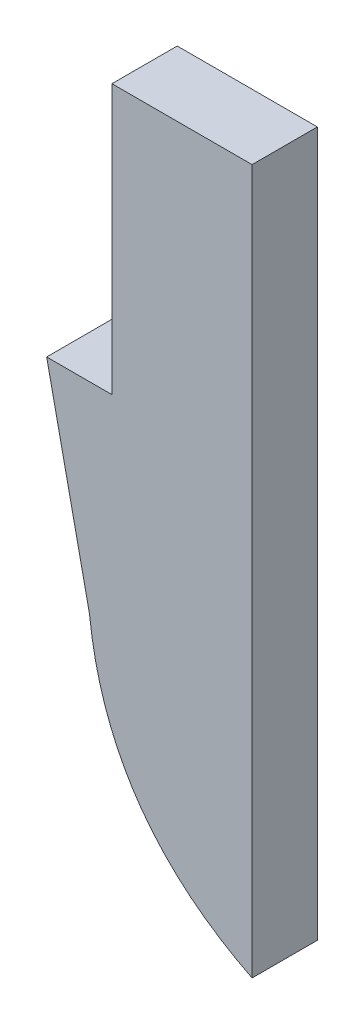
ISO-10303-21;
HEADER;
FILE_DESCRIPTION(('STEP AP214'),'2;1');
FILE_NAME('part.step','',(''),(''),'','','');
FILE_SCHEMA(('AUTOMOTIVE_DESIGN { 1 0 10303 214 1 1 1 1 }'));
ENDSEC;
DATA;
#1=APPLICATION_CONTEXT('core data for automotive mechanical design processes');
#2=APPLICATION_PROTOCOL_DEFINITION('international standard','automotive_design',2000,#1);
#3=PRODUCT_CONTEXT('',#1,'mechanical');
#4=PRODUCT('Part','Part','',(#3));
#5=PRODUCT_RELATED_PRODUCT_CATEGORY('part','',(#4));
#6=PRODUCT_DEFINITION_FORMATION('','',#4);
#7=PRODUCT_DEFINITION_CONTEXT('part definition',#1,'design');
#8=PRODUCT_DEFINITION('design','',#6,#7);
#9=PRODUCT_DEFINITION_SHAPE('','',#8);
#10=(LENGTH_UNIT() NAMED_UNIT(*) SI_UNIT(.MILLI.,.METRE.));
#11=(NAMED_UNIT(*) PLANE_ANGLE_UNIT() SI_UNIT($,.RADIAN.));
#12=(NAMED_UNIT(*) SI_UNIT($,.STERADIAN.) SOLID_ANGLE_UNIT());
#13=UNCERTAINTY_MEASURE_WITH_UNIT(LENGTH_MEASURE(1.E-05),#10,'distance_accuracy_value','');
#14=(GEOMETRIC_REPRESENTATION_CONTEXT(3) GLOBAL_UNCERTAINTY_ASSIGNED_CONTEXT((#13)) GLOBAL_UNIT_ASSIGNED_CONTEXT((#10,
#11,#12)) REPRESENTATION_CONTEXT('',''));
#15=CARTESIAN_POINT('',(0.,0.,0.));
#16=DIRECTION('',(0.,0.,1.));
#17=DIRECTION('',(1.,0.,0.));
#18=AXIS2_PLACEMENT_3D('',#15,#16,#17);
#19=CARTESIAN_POINT('',(-82.4247783156563,-3.69786068719636,4.));
#20=DIRECTION('',(1.,0.,0.));
#21=DIRECTION('',(0.,0.,-1.));
#22=AXIS2_PLACEMENT_3D('',#19,#20,#21);
#23=PLANE('',#22);
#24=DIRECTION('',(0.,-1.,0.));
#25=VECTOR('',#24,1.);
#26=CARTESIAN_POINT('',(-82.4247783156563,-3.69786068719636,0.));
#27=LINE('',#26,#25);
#28=CARTESIAN_POINT('',(-82.4247783156563,-3.69786068719636,0.));
#29=VERTEX_POINT('',#28);
#30=CARTESIAN_POINT('',(-82.4247783156563,-20.1978606871964,0.));
#31=VERTEX_POINT('',#30);
#32=EDGE_CURVE('E119',#29,#31,#27,.T.);
#33=ORIENTED_EDGE('',*,*,#32,.T.);
#34=DIRECTION('',(0.,0.,-1.));
#35=VECTOR('',#34,1.);
#36=CARTESIAN_POINT('',(-82.4247783156563,-20.1978606871964,4.));
#37=LINE('',#36,#35);
#38=CARTESIAN_POINT('',(-82.4247783156563,-20.1978606871964,4.));
#39=VERTEX_POINT('',#38);
#40=EDGE_CURVE('E11',#39,#31,#37,.T.);
#41=ORIENTED_EDGE('',*,*,#40,.F.);
#42=DIRECTION('',(0.,-1.,0.));
#43=VECTOR('',#42,1.);
#44=CARTESIAN_POINT('',(-82.4247783156563,-3.69786068719636,4.));
#45=LINE('',#44,#43);
#46=CARTESIAN_POINT('',(-82.4247783156563,-3.69786068719636,4.));
#47=VERTEX_POINT('',#46);
#48=EDGE_CURVE('E134',#47,#39,#45,.T.);
#49=ORIENTED_EDGE('',*,*,#48,.F.);
#50=DIRECTION('',(0.,0.,-1.));
#51=VECTOR('',#50,1.);
#52=CARTESIAN_POINT('',(-82.4247783156563,-3.69786068719636,4.));
#53=LINE('',#52,#51);
#54=EDGE_CURVE('E112',#47,#29,#53,.T.);
#55=ORIENTED_EDGE('',*,*,#54,.T.);
#56=EDGE_LOOP('',(#33,#41,#49,#55));
#57=FACE_BOUND('',#56,.T.);
#58=ADVANCED_FACE('F32',(#57),#23,.F.);
#59=CARTESIAN_POINT('',(-82.4247783156563,-20.1978606871964,4.));
#60=DIRECTION('',(0.,-1.,0.));
#61=DIRECTION('',(0.,0.,-1.));
#62=AXIS2_PLACEMENT_3D('',#59,#60,#61);
#63=PLANE('',#62);
#64=DIRECTION('',(-1.,0.,0.));
#65=VECTOR('',#64,1.);
#66=CARTESIAN_POINT('',(-82.4247783156563,-20.1978606871964,0.));
#67=LINE('',#66,#65);
#68=CARTESIAN_POINT('',(-86.4247783156563,-20.1978606871964,0.));
#69=VERTEX_POINT('',#68);
#70=EDGE_CURVE('E122',#31,#69,#67,.T.);
#71=ORIENTED_EDGE('',*,*,#70,.T.);
#72=DIRECTION('',(0.,0.,-1.));
#73=VECTOR('',#72,1.);
#74=CARTESIAN_POINT('',(-86.4247783156563,-20.1978606871964,4.));
#75=LINE('',#74,#73);
#76=CARTESIAN_POINT('',(-86.4247783156563,-20.1978606871964,4.));
#77=VERTEX_POINT('',#76);
#78=EDGE_CURVE('E40',#77,#69,#75,.T.);
#79=ORIENTED_EDGE('',*,*,#78,.F.);
#80=DIRECTION('',(-1.,0.,0.));
#81=VECTOR('',#80,1.);
#82=CARTESIAN_POINT('',(-82.4247783156563,-20.1978606871964,4.));
#83=LINE('',#82,#81);
#84=EDGE_CURVE('E85',#39,#77,#83,.T.);
#85=ORIENTED_EDGE('',*,*,#84,.F.);
#86=ORIENTED_EDGE('',*,*,#40,.T.);
#87=EDGE_LOOP('',(#71,#79,#85,#86));
#88=FACE_BOUND('',#87,.T.);
#89=ADVANCED_FACE('F158',(#88),#63,.F.);
#90=CARTESIAN_POINT('',(-86.4247783156563,-20.1978606871964,4.));
#91=DIRECTION('',(0.978101682440699,0.208127602221989,0.));
#92=DIRECTION('',(-0.208127602221989,0.978101682440699,0.));
#93=AXIS2_PLACEMENT_3D('',#90,#91,#92);
#94=PLANE('',#93);
#95=DIRECTION('',(0.208127602221989,-0.978101682440699,0.));
#96=VECTOR('',#95,1.);
#97=CARTESIAN_POINT('',(-86.4247783156563,-20.1978606871964,0.));
#98=LINE('',#97,#96);
#99=CARTESIAN_POINT('',(-83.7953788544437,-32.5547994563157,0.));
#100=VERTEX_POINT('',#99);
#101=EDGE_CURVE('E124',#69,#100,#98,.T.);
#102=ORIENTED_EDGE('',*,*,#101,.T.);
#103=DIRECTION('',(0.,0.,-1.));
#104=VECTOR('',#103,1.);
#105=CARTESIAN_POINT('',(-83.7953788544437,-32.5547994563157,4.));
#106=LINE('',#105,#104);
#107=CARTESIAN_POINT('',(-83.7953788544437,-32.5547994563157,4.));
#108=VERTEX_POINT('',#107);
#109=EDGE_CURVE('E107',#108,#100,#106,.T.);
#110=ORIENTED_EDGE('',*,*,#109,.F.);
#111=DIRECTION('',(0.208127602221989,-0.978101682440699,0.));
#112=VECTOR('',#111,1.);
#113=CARTESIAN_POINT('',(-86.4247783156563,-20.1978606871964,4.));
#114=LINE('',#113,#112);
#115=EDGE_CURVE('E98',#77,#108,#114,.T.);
#116=ORIENTED_EDGE('',*,*,#115,.F.);
#117=ORIENTED_EDGE('',*,*,#78,.T.);
#118=EDGE_LOOP('',(#102,#110,#116,#117));
#119=FACE_BOUND('',#118,.T.);
#120=ADVANCED_FACE('F140',(#119),#94,.F.);
#121=CARTESIAN_POINT('',(-83.7953788544437,-32.5547994563157,4.));
#122=CARTESIAN_POINT('',(-82.7209743375632,-42.4101987800497,4.));
#123=CARTESIAN_POINT('',(-73.8381444014448,-46.8596869037754,4.));
#124=B_SPLINE_CURVE_WITH_KNOTS('',2,(#121,#122,#123),.UNSPECIFIED.,.F.,.F.,(3,3),(0.,1.),.UNSPECIFIED.);
#125=DIRECTION('',(0.,0.,-1.));
#126=VECTOR('',#125,1.);
#127=SURFACE_OF_LINEAR_EXTRUSION('',#124,#126);
#128=CARTESIAN_POINT('',(-83.7953788544437,-32.5547994563157,0.));
#129=CARTESIAN_POINT('',(-82.7209743375632,-42.4101987800497,0.));
#130=CARTESIAN_POINT('',(-73.8381444014448,-46.8596869037754,0.));
#131=B_SPLINE_CURVE_WITH_KNOTS('',2,(#128,#129,#130),.UNSPECIFIED.,.F.,.F.,(3,3),(0.,1.),.UNSPECIFIED.);
#132=CARTESIAN_POINT('',(-73.8381444014448,-46.8596869037754,0.));
#133=VERTEX_POINT('',#132);
#134=EDGE_CURVE('E106',#100,#133,#131,.T.);
#135=ORIENTED_EDGE('',*,*,#134,.T.);
#136=DIRECTION('',(0.,0.,-1.));
#137=VECTOR('',#136,1.);
#138=CARTESIAN_POINT('',(-73.8381444014448,-46.8596869037754,4.));
#139=LINE('',#138,#137);
#140=CARTESIAN_POINT('',(-73.8381444014448,-46.8596869037754,4.));
#141=VERTEX_POINT('',#140);
#142=EDGE_CURVE('E103',#141,#133,#139,.T.);
#143=ORIENTED_EDGE('',*,*,#142,.F.);
#144=EDGE_CURVE('E92',#108,#141,#124,.T.);
#145=ORIENTED_EDGE('',*,*,#144,.F.);
#146=ORIENTED_EDGE('',*,*,#109,.T.);
#147=EDGE_LOOP('',(#135,#143,#145,#146));
#148=FACE_BOUND('',#147,.T.);
#149=ADVANCED_FACE('F104',(#148),#127,.F.);
#150=CARTESIAN_POINT('',(-73.8381444014448,-3.69786068719636,4.));
#151=DIRECTION('',(-1.,0.,0.));
#152=DIRECTION('',(0.,0.,1.));
#153=AXIS2_PLACEMENT_3D('',#150,#151,#152);
#154=PLANE('',#153);
#155=DIRECTION('',(0.,1.,0.));
#156=VECTOR('',#155,1.);
#157=CARTESIAN_POINT('',(-73.8381444014448,-3.69786068719636,0.));
#158=LINE('',#157,#156);
#159=CARTESIAN_POINT('',(-73.8381444014448,-3.69786068719636,0.));
#160=VERTEX_POINT('',#159);
#161=EDGE_CURVE('E71',#133,#160,#158,.T.);
#162=ORIENTED_EDGE('',*,*,#161,.T.);
#163=DIRECTION('',(0.,0.,-1.));
#164=VECTOR('',#163,1.);
#165=CARTESIAN_POINT('',(-73.8381444014448,-3.69786068719636,4.));
#166=LINE('',#165,#164);
#167=CARTESIAN_POINT('',(-73.8381444014448,-3.69786068719636,4.));
#168=VERTEX_POINT('',#167);
#169=EDGE_CURVE('E108',#168,#160,#166,.T.);
#170=ORIENTED_EDGE('',*,*,#169,.F.);
#171=DIRECTION('',(0.,1.,0.));
#172=VECTOR('',#171,1.);
#173=CARTESIAN_POINT('',(-73.8381444014448,-3.69786068719636,4.));
#174=LINE('',#173,#172);
#175=EDGE_CURVE('E96',#141,#168,#174,.T.);
#176=ORIENTED_EDGE('',*,*,#175,.F.);
#177=ORIENTED_EDGE('',*,*,#142,.T.);
#178=EDGE_LOOP('',(#162,#170,#176,#177));
#179=FACE_BOUND('',#178,.T.);
#180=ADVANCED_FACE('F110',(#179),#154,.F.);
#181=CARTESIAN_POINT('',(-82.4247783156563,-3.69786068719636,4.));
#182=DIRECTION('',(0.,-1.,0.));
#183=DIRECTION('',(1.,0.,0.));
#184=AXIS2_PLACEMENT_3D('',#181,#182,#183);
#185=PLANE('',#184);
#186=DIRECTION('',(-1.,0.,0.));
#187=VECTOR('',#186,1.);
#188=CARTESIAN_POINT('',(-82.4247783156563,-3.69786068719636,0.));
#189=LINE('',#188,#187);
#190=EDGE_CURVE('E77',#160,#29,#189,.T.);
#191=ORIENTED_EDGE('',*,*,#190,.T.);
#192=ORIENTED_EDGE('',*,*,#54,.F.);
#193=DIRECTION('',(-1.,0.,0.));
#194=VECTOR('',#193,1.);
#195=CARTESIAN_POINT('',(-82.4247783156563,-3.69786068719636,4.));
#196=LINE('',#195,#194);
#197=EDGE_CURVE('E48',#168,#47,#196,.T.);
#198=ORIENTED_EDGE('',*,*,#197,.F.);
#199=ORIENTED_EDGE('',*,*,#169,.T.);
#200=EDGE_LOOP('',(#191,#192,#198,#199));
#201=FACE_BOUND('',#200,.T.);
#202=ADVANCED_FACE('F147',(#201),#185,.F.);
#203=CARTESIAN_POINT('',(-80.7688679827537,-41.0587209800476,4.));
#204=DIRECTION('',(0.,0.,-1.));
#205=DIRECTION('',(-1.,0.,0.));
#206=AXIS2_PLACEMENT_3D('',#203,#204,#205);
#207=PLANE('',#206);
#208=ORIENTED_EDGE('',*,*,#48,.T.);
#209=ORIENTED_EDGE('',*,*,#84,.T.);
#210=ORIENTED_EDGE('',*,*,#115,.T.);
#211=ORIENTED_EDGE('',*,*,#144,.T.);
#212=ORIENTED_EDGE('',*,*,#175,.T.);
#213=ORIENTED_EDGE('',*,*,#197,.T.);
#214=EDGE_LOOP('',(#208,#209,#210,#211,#212,#213));
#215=FACE_BOUND('',#214,.T.);
#216=ADVANCED_FACE('F94',(#215),#207,.F.);
#217=CARTESIAN_POINT('',(-80.7688679827537,-41.0587209800476,0.));
#218=DIRECTION('',(0.,0.,-1.));
#219=DIRECTION('',(-1.,0.,0.));
#220=AXIS2_PLACEMENT_3D('',#217,#218,#219);
#221=PLANE('',#220);
#222=ORIENTED_EDGE('',*,*,#32,.F.);
#223=ORIENTED_EDGE('',*,*,#190,.F.);
#224=ORIENTED_EDGE('',*,*,#161,.F.);
#225=ORIENTED_EDGE('',*,*,#134,.F.);
#226=ORIENTED_EDGE('',*,*,#101,.F.);
#227=ORIENTED_EDGE('',*,*,#70,.F.);
#228=EDGE_LOOP('',(#222,#223,#224,#225,#226,#227));
#229=FACE_BOUND('',#228,.T.);
#230=ADVANCED_FACE('F143',(#229),#221,.T.);
#231=CLOSED_SHELL('',(#58,#89,#120,#149,#180,#202,#216,#230));
#232=MANIFOLD_SOLID_BREP('B2',#231);
#233=ADVANCED_BREP_SHAPE_REPRESENTATION('',(#18,#232),#14);
#234=SHAPE_DEFINITION_REPRESENTATION(#9,#233);
ENDSEC;
END-ISO-10303-21;
